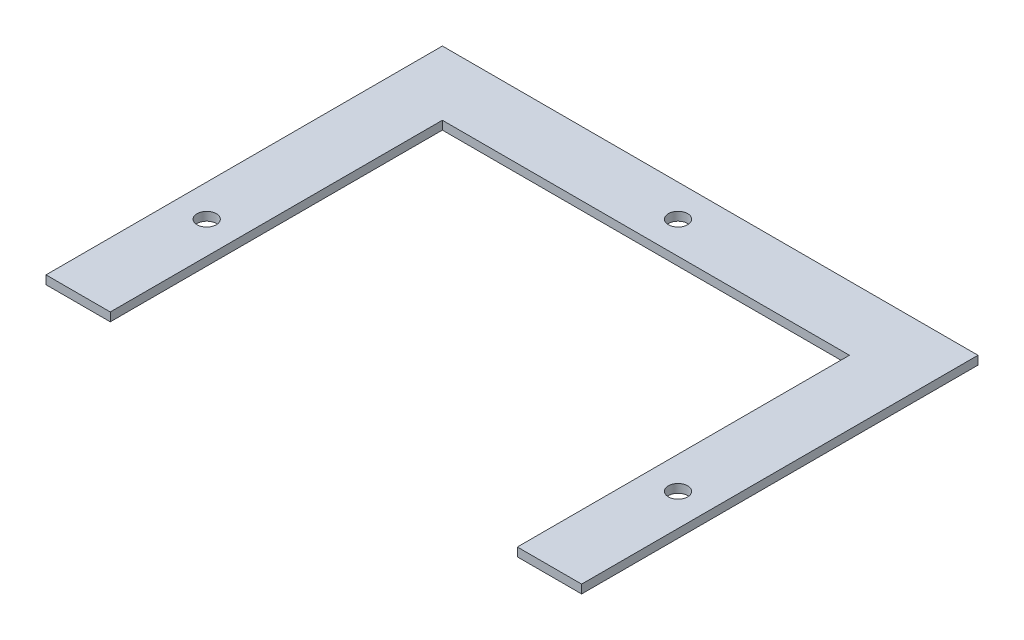
ISO-10303-21;
HEADER;
FILE_DESCRIPTION(('STEP AP214'),'2;1');
FILE_NAME('part.step','',(''),(''),'','','');
FILE_SCHEMA(('AUTOMOTIVE_DESIGN { 1 0 10303 214 1 1 1 1 }'));
ENDSEC;
DATA;
#1=APPLICATION_CONTEXT('core data for automotive mechanical design processes');
#2=APPLICATION_PROTOCOL_DEFINITION('international standard','automotive_design',2000,#1);
#3=PRODUCT_CONTEXT('',#1,'mechanical');
#4=PRODUCT('Part','Part','',(#3));
#5=PRODUCT_RELATED_PRODUCT_CATEGORY('part','',(#4));
#6=PRODUCT_DEFINITION_FORMATION('','',#4);
#7=PRODUCT_DEFINITION_CONTEXT('part definition',#1,'design');
#8=PRODUCT_DEFINITION('design','',#6,#7);
#9=PRODUCT_DEFINITION_SHAPE('','',#8);
#10=(LENGTH_UNIT() NAMED_UNIT(*) SI_UNIT(.MILLI.,.METRE.));
#11=(NAMED_UNIT(*) PLANE_ANGLE_UNIT() SI_UNIT($,.RADIAN.));
#12=(NAMED_UNIT(*) SI_UNIT($,.STERADIAN.) SOLID_ANGLE_UNIT());
#13=UNCERTAINTY_MEASURE_WITH_UNIT(LENGTH_MEASURE(1.E-05),#10,'distance_accuracy_value','');
#14=(GEOMETRIC_REPRESENTATION_CONTEXT(3) GLOBAL_UNCERTAINTY_ASSIGNED_CONTEXT((#13)) GLOBAL_UNIT_ASSIGNED_CONTEXT((#10,
#11,#12)) REPRESENTATION_CONTEXT('',''));
#15=CARTESIAN_POINT('',(0.,0.,0.));
#16=DIRECTION('',(0.,0.,1.));
#17=DIRECTION('',(1.,0.,0.));
#18=AXIS2_PLACEMENT_3D('',#15,#16,#17);
#19=CARTESIAN_POINT('',(0.,4.,0.));
#20=DIRECTION('',(0.,1.,0.));
#21=DIRECTION('',(0.,0.,1.));
#22=AXIS2_PLACEMENT_3D('',#19,#20,#21);
#23=PLANE('',#22);
#24=CARTESIAN_POINT('',(110.,4.,-17.5));
#25=DIRECTION('',(0.,1.,0.));
#26=DIRECTION('',(0.,0.,1.));
#27=AXIS2_PLACEMENT_3D('',#24,#25,#26);
#28=CIRCLE('',#27,4.49999999999999);
#29=CARTESIAN_POINT('',(110.,4.,-13.));
#30=VERTEX_POINT('',#29);
#31=EDGE_CURVE('E201',#30,#30,#28,.F.);
#32=ORIENTED_EDGE('',*,*,#31,.T.);
#33=EDGE_LOOP('',(#32));
#34=FACE_BOUND('',#33,.T.);
#35=CARTESIAN_POINT('',(-110.,4.,-17.5));
#36=DIRECTION('',(0.,1.,0.));
#37=DIRECTION('',(0.,0.,1.));
#38=AXIS2_PLACEMENT_3D('',#35,#36,#37);
#39=CIRCLE('',#38,4.49999999999999);
#40=CARTESIAN_POINT('',(-110.,4.,-13.));
#41=VERTEX_POINT('',#40);
#42=EDGE_CURVE('E195',#41,#41,#39,.T.);
#43=ORIENTED_EDGE('',*,*,#42,.F.);
#44=EDGE_LOOP('',(#43));
#45=FACE_BOUND('',#44,.T.);
#46=CARTESIAN_POINT('',(0.,4.,-127.5));
#47=DIRECTION('',(0.,1.,0.));
#48=DIRECTION('',(0.,0.,1.));
#49=AXIS2_PLACEMENT_3D('',#46,#47,#48);
#50=CIRCLE('',#49,4.50000000000001);
#51=CARTESIAN_POINT('',(0.,4.,-123.));
#52=VERTEX_POINT('',#51);
#53=EDGE_CURVE('E189',#52,#52,#50,.T.);
#54=ORIENTED_EDGE('',*,*,#53,.F.);
#55=EDGE_LOOP('',(#54));
#56=FACE_BOUND('',#55,.T.);
#57=DIRECTION('',(-1.,0.,0.));
#58=VECTOR('',#57,1.);
#59=CARTESIAN_POINT('',(0.,4.,42.5));
#60=LINE('',#59,#58);
#61=CARTESIAN_POINT('',(125.,4.,42.5));
#62=VERTEX_POINT('',#61);
#63=CARTESIAN_POINT('',(95.,4.,42.5));
#64=VERTEX_POINT('',#63);
#65=EDGE_CURVE('E73',#62,#64,#60,.T.);
#66=ORIENTED_EDGE('',*,*,#65,.F.);
#67=DIRECTION('',(0.,0.,-1.));
#68=VECTOR('',#67,1.);
#69=CARTESIAN_POINT('',(125.,4.,0.));
#70=LINE('',#69,#68);
#71=CARTESIAN_POINT('',(125.,4.,-142.5));
#72=VERTEX_POINT('',#71);
#73=EDGE_CURVE('E146',#62,#72,#70,.T.);
#74=ORIENTED_EDGE('',*,*,#73,.T.);
#75=DIRECTION('',(-1.,0.,0.));
#76=VECTOR('',#75,1.);
#77=CARTESIAN_POINT('',(0.,4.,-142.5));
#78=LINE('',#77,#76);
#79=CARTESIAN_POINT('',(-125.,4.,-142.5));
#80=VERTEX_POINT('',#79);
#81=EDGE_CURVE('E149',#72,#80,#78,.T.);
#82=ORIENTED_EDGE('',*,*,#81,.T.);
#83=DIRECTION('',(0.,0.,1.));
#84=VECTOR('',#83,1.);
#85=CARTESIAN_POINT('',(-125.,4.,0.));
#86=LINE('',#85,#84);
#87=CARTESIAN_POINT('',(-125.,4.,42.5));
#88=VERTEX_POINT('',#87);
#89=EDGE_CURVE('E155',#80,#88,#86,.T.);
#90=ORIENTED_EDGE('',*,*,#89,.T.);
#91=CARTESIAN_POINT('',(-95.,4.,42.5));
#92=VERTEX_POINT('',#91);
#93=EDGE_CURVE('E123',#92,#88,#60,.T.);
#94=ORIENTED_EDGE('',*,*,#93,.F.);
#95=DIRECTION('',(0.,0.,1.));
#96=VECTOR('',#95,1.);
#97=CARTESIAN_POINT('',(-95.,4.,112.5));
#98=LINE('',#97,#96);
#99=CARTESIAN_POINT('',(-95.,4.,-112.5));
#100=VERTEX_POINT('',#99);
#101=EDGE_CURVE('E173',#100,#92,#98,.T.);
#102=ORIENTED_EDGE('',*,*,#101,.F.);
#103=DIRECTION('',(-1.,0.,0.));
#104=VECTOR('',#103,1.);
#105=CARTESIAN_POINT('',(-95.,4.,-112.5));
#106=LINE('',#105,#104);
#107=CARTESIAN_POINT('',(95.,4.,-112.5));
#108=VERTEX_POINT('',#107);
#109=EDGE_CURVE('E182',#108,#100,#106,.T.);
#110=ORIENTED_EDGE('',*,*,#109,.F.);
#111=DIRECTION('',(0.,0.,-1.));
#112=VECTOR('',#111,1.);
#113=CARTESIAN_POINT('',(95.,4.,112.5));
#114=LINE('',#113,#112);
#115=EDGE_CURVE('E175',#64,#108,#114,.T.);
#116=ORIENTED_EDGE('',*,*,#115,.F.);
#117=EDGE_LOOP('',(#66,#74,#82,#90,#94,#102,#110,#116));
#118=FACE_BOUND('',#117,.T.);
#119=ADVANCED_FACE('F58',(#34,#45,#56,#118),#23,.T.);
#120=CARTESIAN_POINT('',(0.,0.,0.));
#121=DIRECTION('',(0.,1.,0.));
#122=DIRECTION('',(0.,0.,1.));
#123=AXIS2_PLACEMENT_3D('',#120,#121,#122);
#124=PLANE('',#123);
#125=CARTESIAN_POINT('',(110.,0.,-17.5));
#126=DIRECTION('',(0.,1.,0.));
#127=DIRECTION('',(0.,0.,-1.));
#128=AXIS2_PLACEMENT_3D('',#125,#126,#127);
#129=CIRCLE('',#128,4.49999999999999);
#130=CARTESIAN_POINT('',(110.,0.,-22.));
#131=VERTEX_POINT('',#130);
#132=EDGE_CURVE('E204',#131,#131,#129,.T.);
#133=ORIENTED_EDGE('',*,*,#132,.T.);
#134=EDGE_LOOP('',(#133));
#135=FACE_BOUND('',#134,.T.);
#136=CARTESIAN_POINT('',(-110.,0.,-17.5));
#137=DIRECTION('',(0.,-1.,0.));
#138=DIRECTION('',(0.,0.,-1.));
#139=AXIS2_PLACEMENT_3D('',#136,#137,#138);
#140=CIRCLE('',#139,4.49999999999999);
#141=CARTESIAN_POINT('',(-110.,0.,-22.));
#142=VERTEX_POINT('',#141);
#143=EDGE_CURVE('E198',#142,#142,#140,.T.);
#144=ORIENTED_EDGE('',*,*,#143,.F.);
#145=EDGE_LOOP('',(#144));
#146=FACE_BOUND('',#145,.T.);
#147=CARTESIAN_POINT('',(0.,0.,-127.5));
#148=DIRECTION('',(0.,-1.,0.));
#149=DIRECTION('',(0.,0.,-1.));
#150=AXIS2_PLACEMENT_3D('',#147,#148,#149);
#151=CIRCLE('',#150,4.50000000000001);
#152=CARTESIAN_POINT('',(0.,0.,-132.));
#153=VERTEX_POINT('',#152);
#154=EDGE_CURVE('E192',#153,#153,#151,.T.);
#155=ORIENTED_EDGE('',*,*,#154,.F.);
#156=EDGE_LOOP('',(#155));
#157=FACE_BOUND('',#156,.T.);
#158=DIRECTION('',(0.,0.,-1.));
#159=VECTOR('',#158,1.);
#160=CARTESIAN_POINT('',(125.,0.,0.));
#161=LINE('',#160,#159);
#162=CARTESIAN_POINT('',(125.,0.,42.5));
#163=VERTEX_POINT('',#162);
#164=CARTESIAN_POINT('',(125.,0.,-142.5));
#165=VERTEX_POINT('',#164);
#166=EDGE_CURVE('E151',#163,#165,#161,.T.);
#167=ORIENTED_EDGE('',*,*,#166,.F.);
#168=DIRECTION('',(1.,0.,0.));
#169=VECTOR('',#168,1.);
#170=CARTESIAN_POINT('',(-125.,0.,42.5));
#171=LINE('',#170,#169);
#172=CARTESIAN_POINT('',(95.,0.,42.5));
#173=VERTEX_POINT('',#172);
#174=EDGE_CURVE('E140',#173,#163,#171,.T.);
#175=ORIENTED_EDGE('',*,*,#174,.F.);
#176=DIRECTION('',(0.,0.,-1.));
#177=VECTOR('',#176,1.);
#178=CARTESIAN_POINT('',(95.,0.,112.5));
#179=LINE('',#178,#177);
#180=CARTESIAN_POINT('',(95.,0.,-112.5));
#181=VERTEX_POINT('',#180);
#182=EDGE_CURVE('E178',#173,#181,#179,.T.);
#183=ORIENTED_EDGE('',*,*,#182,.T.);
#184=DIRECTION('',(-1.,0.,0.));
#185=VECTOR('',#184,1.);
#186=CARTESIAN_POINT('',(-95.,0.,-112.5));
#187=LINE('',#186,#185);
#188=CARTESIAN_POINT('',(-95.,0.,-112.5));
#189=VERTEX_POINT('',#188);
#190=EDGE_CURVE('E176',#181,#189,#187,.T.);
#191=ORIENTED_EDGE('',*,*,#190,.T.);
#192=DIRECTION('',(0.,0.,1.));
#193=VECTOR('',#192,1.);
#194=CARTESIAN_POINT('',(-95.,0.,112.5));
#195=LINE('',#194,#193);
#196=CARTESIAN_POINT('',(-95.,0.,42.5));
#197=VERTEX_POINT('',#196);
#198=EDGE_CURVE('E139',#189,#197,#195,.T.);
#199=ORIENTED_EDGE('',*,*,#198,.T.);
#200=CARTESIAN_POINT('',(-125.,0.,42.5));
#201=VERTEX_POINT('',#200);
#202=EDGE_CURVE('E80',#201,#197,#171,.T.);
#203=ORIENTED_EDGE('',*,*,#202,.F.);
#204=DIRECTION('',(0.,0.,1.));
#205=VECTOR('',#204,1.);
#206=CARTESIAN_POINT('',(-125.,0.,0.));
#207=LINE('',#206,#205);
#208=CARTESIAN_POINT('',(-125.,0.,-142.5));
#209=VERTEX_POINT('',#208);
#210=EDGE_CURVE('E136',#209,#201,#207,.T.);
#211=ORIENTED_EDGE('',*,*,#210,.F.);
#212=DIRECTION('',(-1.,0.,0.));
#213=VECTOR('',#212,1.);
#214=CARTESIAN_POINT('',(0.,0.,-142.5));
#215=LINE('',#214,#213);
#216=EDGE_CURVE('E147',#165,#209,#215,.T.);
#217=ORIENTED_EDGE('',*,*,#216,.F.);
#218=EDGE_LOOP('',(#167,#175,#183,#191,#199,#203,#211,#217));
#219=FACE_BOUND('',#218,.T.);
#220=ADVANCED_FACE('F134',(#135,#146,#157,#219),#124,.F.);
#221=CARTESIAN_POINT('',(125.,4.,0.));
#222=DIRECTION('',(-1.,0.,0.));
#223=DIRECTION('',(0.,0.,1.));
#224=AXIS2_PLACEMENT_3D('',#221,#222,#223);
#225=PLANE('',#224);
#226=ORIENTED_EDGE('',*,*,#73,.F.);
#227=DIRECTION('',(0.,-1.,0.));
#228=VECTOR('',#227,1.);
#229=CARTESIAN_POINT('',(125.,10.,42.5));
#230=LINE('',#229,#228);
#231=EDGE_CURVE('E128',#62,#163,#230,.T.);
#232=ORIENTED_EDGE('',*,*,#231,.T.);
#233=ORIENTED_EDGE('',*,*,#166,.T.);
#234=DIRECTION('',(0.,-1.,0.));
#235=VECTOR('',#234,1.);
#236=CARTESIAN_POINT('',(125.,4.,-142.5));
#237=LINE('',#236,#235);
#238=EDGE_CURVE('E66',#72,#165,#237,.T.);
#239=ORIENTED_EDGE('',*,*,#238,.F.);
#240=EDGE_LOOP('',(#226,#232,#233,#239));
#241=FACE_BOUND('',#240,.T.);
#242=ADVANCED_FACE('F60',(#241),#225,.F.);
#243=CARTESIAN_POINT('',(0.,4.,-142.5));
#244=DIRECTION('',(0.,0.,1.));
#245=DIRECTION('',(1.,0.,0.));
#246=AXIS2_PLACEMENT_3D('',#243,#244,#245);
#247=PLANE('',#246);
#248=ORIENTED_EDGE('',*,*,#216,.T.);
#249=DIRECTION('',(0.,-1.,0.));
#250=VECTOR('',#249,1.);
#251=CARTESIAN_POINT('',(-125.,4.,-142.5));
#252=LINE('',#251,#250);
#253=EDGE_CURVE('E145',#80,#209,#252,.T.);
#254=ORIENTED_EDGE('',*,*,#253,.F.);
#255=ORIENTED_EDGE('',*,*,#81,.F.);
#256=ORIENTED_EDGE('',*,*,#238,.T.);
#257=EDGE_LOOP('',(#248,#254,#255,#256));
#258=FACE_BOUND('',#257,.T.);
#259=ADVANCED_FACE('F160',(#258),#247,.F.);
#260=CARTESIAN_POINT('',(-125.,4.,0.));
#261=DIRECTION('',(1.,0.,0.));
#262=DIRECTION('',(0.,0.,-1.));
#263=AXIS2_PLACEMENT_3D('',#260,#261,#262);
#264=PLANE('',#263);
#265=ORIENTED_EDGE('',*,*,#210,.T.);
#266=DIRECTION('',(0.,-1.,0.));
#267=VECTOR('',#266,1.);
#268=CARTESIAN_POINT('',(-125.,10.,42.5));
#269=LINE('',#268,#267);
#270=EDGE_CURVE('E120',#88,#201,#269,.T.);
#271=ORIENTED_EDGE('',*,*,#270,.F.);
#272=ORIENTED_EDGE('',*,*,#89,.F.);
#273=ORIENTED_EDGE('',*,*,#253,.T.);
#274=EDGE_LOOP('',(#265,#271,#272,#273));
#275=FACE_BOUND('',#274,.T.);
#276=ADVANCED_FACE('F143',(#275),#264,.F.);
#277=CARTESIAN_POINT('',(95.,4.,112.5));
#278=DIRECTION('',(-1.,0.,0.));
#279=DIRECTION('',(0.,0.,1.));
#280=AXIS2_PLACEMENT_3D('',#277,#278,#279);
#281=PLANE('',#280);
#282=DIRECTION('',(0.,-1.,0.));
#283=VECTOR('',#282,1.);
#284=CARTESIAN_POINT('',(95.,4.,42.5));
#285=LINE('',#284,#283);
#286=EDGE_CURVE('E185',#64,#173,#285,.T.);
#287=ORIENTED_EDGE('',*,*,#286,.F.);
#288=ORIENTED_EDGE('',*,*,#115,.T.);
#289=DIRECTION('',(0.,-1.,0.));
#290=VECTOR('',#289,1.);
#291=CARTESIAN_POINT('',(95.,4.,-112.5));
#292=LINE('',#291,#290);
#293=EDGE_CURVE('E165',#108,#181,#292,.T.);
#294=ORIENTED_EDGE('',*,*,#293,.T.);
#295=ORIENTED_EDGE('',*,*,#182,.F.);
#296=EDGE_LOOP('',(#287,#288,#294,#295));
#297=FACE_BOUND('',#296,.T.);
#298=ADVANCED_FACE('F231',(#297),#281,.T.);
#299=CARTESIAN_POINT('',(-95.,4.,-112.5));
#300=DIRECTION('',(0.,0.,1.));
#301=DIRECTION('',(1.,0.,0.));
#302=AXIS2_PLACEMENT_3D('',#299,#300,#301);
#303=PLANE('',#302);
#304=ORIENTED_EDGE('',*,*,#190,.F.);
#305=ORIENTED_EDGE('',*,*,#293,.F.);
#306=ORIENTED_EDGE('',*,*,#109,.T.);
#307=DIRECTION('',(0.,-1.,0.));
#308=VECTOR('',#307,1.);
#309=CARTESIAN_POINT('',(-95.,4.,-112.5));
#310=LINE('',#309,#308);
#311=EDGE_CURVE('E167',#100,#189,#310,.T.);
#312=ORIENTED_EDGE('',*,*,#311,.T.);
#313=EDGE_LOOP('',(#304,#305,#306,#312));
#314=FACE_BOUND('',#313,.T.);
#315=ADVANCED_FACE('F291',(#314),#303,.T.);
#316=CARTESIAN_POINT('',(-95.,4.,112.5));
#317=DIRECTION('',(1.,0.,0.));
#318=DIRECTION('',(0.,0.,-1.));
#319=AXIS2_PLACEMENT_3D('',#316,#317,#318);
#320=PLANE('',#319);
#321=DIRECTION('',(0.,1.,0.));
#322=VECTOR('',#321,1.);
#323=CARTESIAN_POINT('',(-95.,4.,42.5));
#324=LINE('',#323,#322);
#325=EDGE_CURVE('E12',#197,#92,#324,.T.);
#326=ORIENTED_EDGE('',*,*,#325,.F.);
#327=ORIENTED_EDGE('',*,*,#198,.F.);
#328=ORIENTED_EDGE('',*,*,#311,.F.);
#329=ORIENTED_EDGE('',*,*,#101,.T.);
#330=EDGE_LOOP('',(#326,#327,#328,#329));
#331=FACE_BOUND('',#330,.T.);
#332=ADVANCED_FACE('F284',(#331),#320,.T.);
#333=CARTESIAN_POINT('',(-125.,10.,42.5));
#334=DIRECTION('',(0.,0.,-1.));
#335=DIRECTION('',(-1.,0.,0.));
#336=AXIS2_PLACEMENT_3D('',#333,#334,#335);
#337=PLANE('',#336);
#338=ORIENTED_EDGE('',*,*,#93,.T.);
#339=ORIENTED_EDGE('',*,*,#270,.T.);
#340=ORIENTED_EDGE('',*,*,#202,.T.);
#341=ORIENTED_EDGE('',*,*,#325,.T.);
#342=EDGE_LOOP('',(#338,#339,#340,#341));
#343=FACE_BOUND('',#342,.T.);
#344=ADVANCED_FACE('F121',(#343),#337,.F.);
#345=ORIENTED_EDGE('',*,*,#65,.T.);
#346=ORIENTED_EDGE('',*,*,#286,.T.);
#347=ORIENTED_EDGE('',*,*,#174,.T.);
#348=ORIENTED_EDGE('',*,*,#231,.F.);
#349=EDGE_LOOP('',(#345,#346,#347,#348));
#350=FACE_BOUND('',#349,.T.);
#351=ADVANCED_FACE('F268',(#350),#337,.F.);
#352=CARTESIAN_POINT('',(0.,10.,-127.5));
#353=DIRECTION('',(0.,-1.,0.));
#354=DIRECTION('',(0.,0.,-1.));
#355=AXIS2_PLACEMENT_3D('',#352,#353,#354);
#356=CYLINDRICAL_SURFACE('',#355,4.50000000000001);
#357=ORIENTED_EDGE('',*,*,#53,.T.);
#358=EDGE_LOOP('',(#357));
#359=FACE_BOUND('',#358,.T.);
#360=ORIENTED_EDGE('',*,*,#154,.T.);
#361=EDGE_LOOP('',(#360));
#362=FACE_BOUND('',#361,.T.);
#363=ADVANCED_FACE('F218',(#359,#362),#356,.F.);
#364=CARTESIAN_POINT('',(-110.,10.,-17.5));
#365=DIRECTION('',(0.,-1.,0.));
#366=DIRECTION('',(0.,0.,-1.));
#367=AXIS2_PLACEMENT_3D('',#364,#365,#366);
#368=CYLINDRICAL_SURFACE('',#367,4.49999999999999);
#369=ORIENTED_EDGE('',*,*,#42,.T.);
#370=EDGE_LOOP('',(#369));
#371=FACE_BOUND('',#370,.T.);
#372=ORIENTED_EDGE('',*,*,#143,.T.);
#373=EDGE_LOOP('',(#372));
#374=FACE_BOUND('',#373,.T.);
#375=ADVANCED_FACE('F212',(#371,#374),#368,.F.);
#376=CARTESIAN_POINT('',(110.,10.,-17.5));
#377=DIRECTION('',(0.,-1.,0.));
#378=DIRECTION('',(0.,0.,-1.));
#379=AXIS2_PLACEMENT_3D('',#376,#377,#378);
#380=CYLINDRICAL_SURFACE('',#379,4.49999999999999);
#381=ORIENTED_EDGE('',*,*,#31,.F.);
#382=EDGE_LOOP('',(#381));
#383=FACE_BOUND('',#382,.T.);
#384=ORIENTED_EDGE('',*,*,#132,.F.);
#385=EDGE_LOOP('',(#384));
#386=FACE_BOUND('',#385,.T.);
#387=ADVANCED_FACE('F210',(#383,#386),#380,.F.);
#388=CLOSED_SHELL('',(#119,#220,#242,#259,#276,#298,#315,#332,#344,#351,#363,#375,#387));
#389=MANIFOLD_SOLID_BREP('B2',#388);
#390=ADVANCED_BREP_SHAPE_REPRESENTATION('',(#18,#389),#14);
#391=SHAPE_DEFINITION_REPRESENTATION(#9,#390);
ENDSEC;
END-ISO-10303-21;
